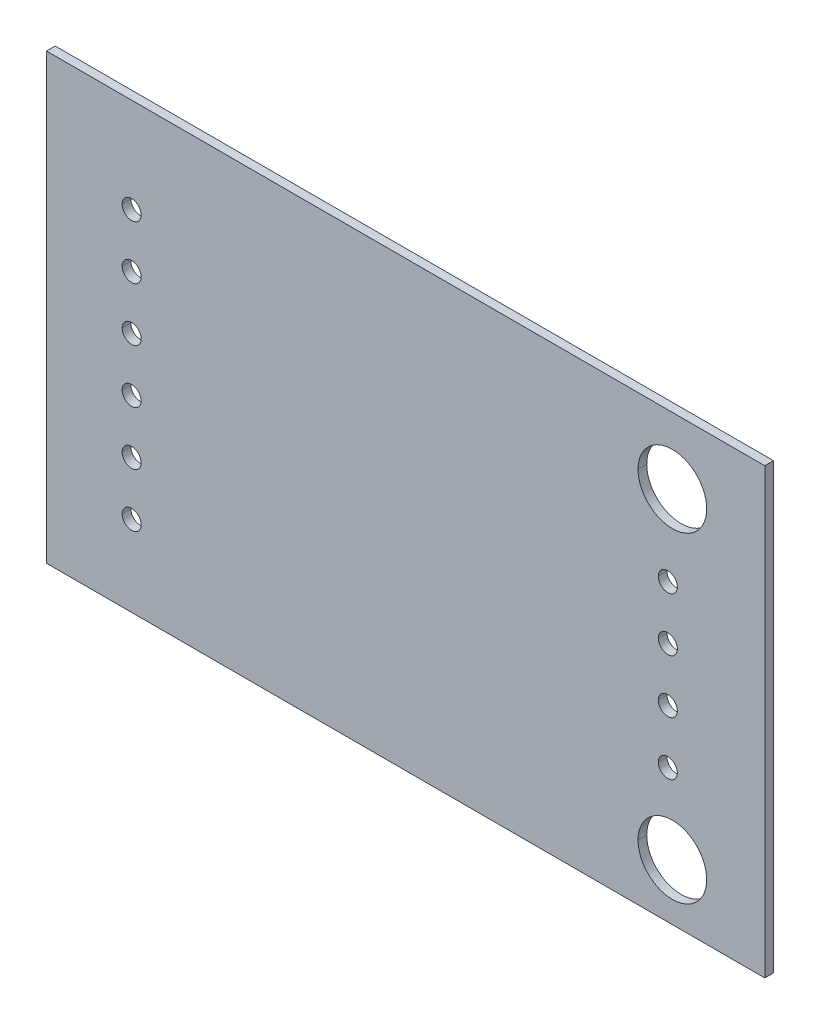
ISO-10303-21;
HEADER;
FILE_DESCRIPTION(('STEP AP214'),'2;1');
FILE_NAME('part.step','',(''),(''),'','','');
FILE_SCHEMA(('AUTOMOTIVE_DESIGN { 1 0 10303 214 1 1 1 1 }'));
ENDSEC;
DATA;
#1=APPLICATION_CONTEXT('core data for automotive mechanical design processes');
#2=APPLICATION_PROTOCOL_DEFINITION('international standard','automotive_design',2000,#1);
#3=PRODUCT_CONTEXT('',#1,'mechanical');
#4=PRODUCT('Part','Part','',(#3));
#5=PRODUCT_RELATED_PRODUCT_CATEGORY('part','',(#4));
#6=PRODUCT_DEFINITION_FORMATION('','',#4);
#7=PRODUCT_DEFINITION_CONTEXT('part definition',#1,'design');
#8=PRODUCT_DEFINITION('design','',#6,#7);
#9=PRODUCT_DEFINITION_SHAPE('','',#8);
#10=(LENGTH_UNIT() NAMED_UNIT(*) SI_UNIT(.MILLI.,.METRE.));
#11=(NAMED_UNIT(*) PLANE_ANGLE_UNIT() SI_UNIT($,.RADIAN.));
#12=(NAMED_UNIT(*) SI_UNIT($,.STERADIAN.) SOLID_ANGLE_UNIT());
#13=UNCERTAINTY_MEASURE_WITH_UNIT(LENGTH_MEASURE(1.E-05),#10,'distance_accuracy_value','');
#14=(GEOMETRIC_REPRESENTATION_CONTEXT(3) GLOBAL_UNCERTAINTY_ASSIGNED_CONTEXT((#13)) GLOBAL_UNIT_ASSIGNED_CONTEXT((#10,
#11,#12)) REPRESENTATION_CONTEXT('',''));
#15=CARTESIAN_POINT('',(0.,0.,0.));
#16=DIRECTION('',(0.,0.,1.));
#17=DIRECTION('',(1.,0.,0.));
#18=AXIS2_PLACEMENT_3D('',#15,#16,#17);
#19=CARTESIAN_POINT('',(29.6250486426,2.658236218721,0.));
#20=DIRECTION('',(0.,0.,1.));
#21=DIRECTION('',(1.,0.,0.));
#22=AXIS2_PLACEMENT_3D('',#19,#20,#21);
#23=CYLINDRICAL_SURFACE('',#22,1.625);
#24=CARTESIAN_POINT('',(29.6250486426,2.658236218721,0.));
#25=DIRECTION('',(0.,0.,1.));
#26=DIRECTION('',(1.,0.,0.));
#27=AXIS2_PLACEMENT_3D('',#24,#25,#26);
#28=CIRCLE('',#27,1.625);
#29=CARTESIAN_POINT('',(28.0000486426,2.658236218721,0.));
#30=VERTEX_POINT('',#29);
#31=CARTESIAN_POINT('',(31.2500486426,2.658236218721,0.));
#32=VERTEX_POINT('',#31);
#33=EDGE_CURVE('E41',#30,#32,#28,.T.);
#34=ORIENTED_EDGE('',*,*,#33,.F.);
#35=DIRECTION('',(0.,0.,1.));
#36=VECTOR('',#35,1.);
#37=CARTESIAN_POINT('',(28.0000486426,2.658236218721,0.));
#38=LINE('',#37,#36);
#39=CARTESIAN_POINT('',(28.0000486426,2.658236218721,0.41148));
#40=VERTEX_POINT('',#39);
#41=EDGE_CURVE('E11',#30,#40,#38,.T.);
#42=ORIENTED_EDGE('',*,*,#41,.T.);
#43=CARTESIAN_POINT('',(29.6250486426,2.658236218721,0.41148));
#44=DIRECTION('',(0.,0.,1.));
#45=DIRECTION('',(1.,0.,0.));
#46=AXIS2_PLACEMENT_3D('',#43,#44,#45);
#47=CIRCLE('',#46,1.625);
#48=CARTESIAN_POINT('',(31.2500486426,2.658236218721,0.41148));
#49=VERTEX_POINT('',#48);
#50=EDGE_CURVE('E28',#40,#49,#47,.T.);
#51=ORIENTED_EDGE('',*,*,#50,.T.);
#52=DIRECTION('',(0.,0.,1.));
#53=VECTOR('',#52,1.);
#54=CARTESIAN_POINT('',(31.2500486426,2.658236218721,0.));
#55=LINE('',#54,#53);
#56=EDGE_CURVE('E479',#32,#49,#55,.T.);
#57=ORIENTED_EDGE('',*,*,#56,.F.);
#58=EDGE_LOOP('',(#34,#42,#51,#57));
#59=FACE_BOUND('',#58,.T.);
#60=ADVANCED_FACE('F17',(#59),#23,.F.);
#61=CARTESIAN_POINT('',(29.6250486426,17.858037309221,0.));
#62=DIRECTION('',(0.,0.,1.));
#63=DIRECTION('',(1.,0.,0.));
#64=AXIS2_PLACEMENT_3D('',#61,#62,#63);
#65=CYLINDRICAL_SURFACE('',#64,1.625);
#66=CARTESIAN_POINT('',(29.6250486426,17.858037309221,0.));
#67=DIRECTION('',(0.,0.,1.));
#68=DIRECTION('',(1.,0.,0.));
#69=AXIS2_PLACEMENT_3D('',#66,#67,#68);
#70=CIRCLE('',#69,1.625);
#71=CARTESIAN_POINT('',(28.0000486426,17.858037309221,0.));
#72=VERTEX_POINT('',#71);
#73=CARTESIAN_POINT('',(31.2500486426,17.858037309221,0.));
#74=VERTEX_POINT('',#73);
#75=EDGE_CURVE('E282',#72,#74,#70,.T.);
#76=ORIENTED_EDGE('',*,*,#75,.F.);
#77=DIRECTION('',(0.,0.,1.));
#78=VECTOR('',#77,1.);
#79=CARTESIAN_POINT('',(28.0000486426,17.858037309221,0.));
#80=LINE('',#79,#78);
#81=CARTESIAN_POINT('',(28.0000486426,17.858037309221,0.41148));
#82=VERTEX_POINT('',#81);
#83=EDGE_CURVE('E408',#72,#82,#80,.T.);
#84=ORIENTED_EDGE('',*,*,#83,.T.);
#85=CARTESIAN_POINT('',(29.6250486426,17.858037309221,0.41148));
#86=DIRECTION('',(0.,0.,1.));
#87=DIRECTION('',(1.,0.,0.));
#88=AXIS2_PLACEMENT_3D('',#85,#86,#87);
#89=CIRCLE('',#88,1.625);
#90=CARTESIAN_POINT('',(31.2500486426,17.858037309221,0.41148));
#91=VERTEX_POINT('',#90);
#92=EDGE_CURVE('E309',#82,#91,#89,.T.);
#93=ORIENTED_EDGE('',*,*,#92,.T.);
#94=DIRECTION('',(0.,0.,1.));
#95=VECTOR('',#94,1.);
#96=CARTESIAN_POINT('',(31.2500486426,17.858037309221,0.));
#97=LINE('',#96,#95);
#98=EDGE_CURVE('E470',#74,#91,#97,.T.);
#99=ORIENTED_EDGE('',*,*,#98,.F.);
#100=EDGE_LOOP('',(#76,#84,#93,#99));
#101=FACE_BOUND('',#100,.T.);
#102=ADVANCED_FACE('F655',(#101),#65,.F.);
#103=CARTESIAN_POINT('',(4.030717621834,8.895479676781,0.));
#104=DIRECTION('',(0.,0.,1.));
#105=DIRECTION('',(1.,0.,0.));
#106=AXIS2_PLACEMENT_3D('',#103,#104,#105);
#107=CYLINDRICAL_SURFACE('',#106,0.4499991);
#108=CARTESIAN_POINT('',(4.030717621834,8.895479676781,0.));
#109=DIRECTION('',(0.,0.,1.));
#110=DIRECTION('',(-1.,0.,0.));
#111=AXIS2_PLACEMENT_3D('',#108,#109,#110);
#112=CIRCLE('',#111,0.4499991);
#113=CARTESIAN_POINT('',(3.580718521834,8.895479676781,0.));
#114=VERTEX_POINT('',#113);
#115=CARTESIAN_POINT('',(4.480716721834,8.895479676781,0.));
#116=VERTEX_POINT('',#115);
#117=EDGE_CURVE('E393',#114,#116,#112,.T.);
#118=ORIENTED_EDGE('',*,*,#117,.F.);
#119=DIRECTION('',(0.,0.,1.));
#120=VECTOR('',#119,1.);
#121=CARTESIAN_POINT('',(3.580718521834,8.895479676781,0.));
#122=LINE('',#121,#120);
#123=CARTESIAN_POINT('',(3.580718521834,8.895479676781,0.41148));
#124=VERTEX_POINT('',#123);
#125=EDGE_CURVE('E305',#114,#124,#122,.T.);
#126=ORIENTED_EDGE('',*,*,#125,.T.);
#127=CARTESIAN_POINT('',(4.030717621834,8.895479676781,0.41148));
#128=DIRECTION('',(0.,0.,1.));
#129=DIRECTION('',(-1.,0.,0.));
#130=AXIS2_PLACEMENT_3D('',#127,#128,#129);
#131=CIRCLE('',#130,0.4499991);
#132=CARTESIAN_POINT('',(4.480716721834,8.895479676781,0.41148));
#133=VERTEX_POINT('',#132);
#134=EDGE_CURVE('E310',#124,#133,#131,.T.);
#135=ORIENTED_EDGE('',*,*,#134,.T.);
#136=DIRECTION('',(0.,0.,1.));
#137=VECTOR('',#136,1.);
#138=CARTESIAN_POINT('',(4.480716721834,8.895479676781,0.));
#139=LINE('',#138,#137);
#140=EDGE_CURVE('E362',#116,#133,#139,.T.);
#141=ORIENTED_EDGE('',*,*,#140,.F.);
#142=EDGE_LOOP('',(#118,#126,#135,#141));
#143=FACE_BOUND('',#142,.T.);
#144=ADVANCED_FACE('F659',(#143),#107,.F.);
#145=CARTESIAN_POINT('',(4.030717621834,6.355479676781,0.));
#146=DIRECTION('',(0.,0.,1.));
#147=DIRECTION('',(1.,0.,0.));
#148=AXIS2_PLACEMENT_3D('',#145,#146,#147);
#149=CYLINDRICAL_SURFACE('',#148,0.4499991);
#150=CARTESIAN_POINT('',(4.030717621834,6.355479676781,0.));
#151=DIRECTION('',(0.,0.,1.));
#152=DIRECTION('',(-1.,0.,0.));
#153=AXIS2_PLACEMENT_3D('',#150,#151,#152);
#154=CIRCLE('',#153,0.4499991);
#155=CARTESIAN_POINT('',(3.580718521834,6.355479676781,0.));
#156=VERTEX_POINT('',#155);
#157=CARTESIAN_POINT('',(4.480716721834,6.355479676781,0.));
#158=VERTEX_POINT('',#157);
#159=EDGE_CURVE('E367',#156,#158,#154,.T.);
#160=ORIENTED_EDGE('',*,*,#159,.F.);
#161=DIRECTION('',(0.,0.,1.));
#162=VECTOR('',#161,1.);
#163=CARTESIAN_POINT('',(3.580718521834,6.355479676781,0.));
#164=LINE('',#163,#162);
#165=CARTESIAN_POINT('',(3.580718521834,6.355479676781,0.41148));
#166=VERTEX_POINT('',#165);
#167=EDGE_CURVE('E342',#156,#166,#164,.T.);
#168=ORIENTED_EDGE('',*,*,#167,.T.);
#169=CARTESIAN_POINT('',(4.030717621834,6.355479676781,0.41148));
#170=DIRECTION('',(0.,0.,1.));
#171=DIRECTION('',(-1.,0.,0.));
#172=AXIS2_PLACEMENT_3D('',#169,#170,#171);
#173=CIRCLE('',#172,0.4499991);
#174=CARTESIAN_POINT('',(4.480716721834,6.355479676781,0.41148));
#175=VERTEX_POINT('',#174);
#176=EDGE_CURVE('E346',#166,#175,#173,.T.);
#177=ORIENTED_EDGE('',*,*,#176,.T.);
#178=DIRECTION('',(0.,0.,1.));
#179=VECTOR('',#178,1.);
#180=CARTESIAN_POINT('',(4.480716721834,6.355479676781,0.));
#181=LINE('',#180,#179);
#182=EDGE_CURVE('E361',#158,#175,#181,.T.);
#183=ORIENTED_EDGE('',*,*,#182,.F.);
#184=EDGE_LOOP('',(#160,#168,#177,#183));
#185=FACE_BOUND('',#184,.T.);
#186=ADVANCED_FACE('F19',(#185),#149,.F.);
#187=CARTESIAN_POINT('',(4.030717621834,16.515479676781,0.));
#188=DIRECTION('',(0.,0.,1.));
#189=DIRECTION('',(1.,0.,0.));
#190=AXIS2_PLACEMENT_3D('',#187,#188,#189);
#191=CYLINDRICAL_SURFACE('',#190,0.4499991);
#192=CARTESIAN_POINT('',(4.030717621834,16.515479676781,0.));
#193=DIRECTION('',(0.,0.,1.));
#194=DIRECTION('',(-1.,0.,0.));
#195=AXIS2_PLACEMENT_3D('',#192,#193,#194);
#196=CIRCLE('',#195,0.4499991);
#197=CARTESIAN_POINT('',(3.580718521834,16.515479676781,0.));
#198=VERTEX_POINT('',#197);
#199=CARTESIAN_POINT('',(4.480716721834,16.515479676781,0.));
#200=VERTEX_POINT('',#199);
#201=EDGE_CURVE('E284',#198,#200,#196,.T.);
#202=ORIENTED_EDGE('',*,*,#201,.F.);
#203=DIRECTION('',(0.,0.,1.));
#204=VECTOR('',#203,1.);
#205=CARTESIAN_POINT('',(3.580718521834,16.515479676781,0.));
#206=LINE('',#205,#204);
#207=CARTESIAN_POINT('',(3.580718521834,16.515479676781,0.41148));
#208=VERTEX_POINT('',#207);
#209=EDGE_CURVE('E392',#198,#208,#206,.T.);
#210=ORIENTED_EDGE('',*,*,#209,.T.);
#211=CARTESIAN_POINT('',(4.030717621834,16.515479676781,0.41148));
#212=DIRECTION('',(0.,0.,1.));
#213=DIRECTION('',(-1.,0.,0.));
#214=AXIS2_PLACEMENT_3D('',#211,#212,#213);
#215=CIRCLE('',#214,0.4499991);
#216=CARTESIAN_POINT('',(4.480716721834,16.515479676781,0.41148));
#217=VERTEX_POINT('',#216);
#218=EDGE_CURVE('E432',#208,#217,#215,.T.);
#219=ORIENTED_EDGE('',*,*,#218,.T.);
#220=DIRECTION('',(0.,0.,1.));
#221=VECTOR('',#220,1.);
#222=CARTESIAN_POINT('',(4.480716721834,16.515479676781,0.));
#223=LINE('',#222,#221);
#224=EDGE_CURVE('E377',#200,#217,#223,.T.);
#225=ORIENTED_EDGE('',*,*,#224,.F.);
#226=EDGE_LOOP('',(#202,#210,#219,#225));
#227=FACE_BOUND('',#226,.T.);
#228=ADVANCED_FACE('F674',(#227),#191,.F.);
#229=CARTESIAN_POINT('',(4.030717621834,11.435479676781,0.));
#230=DIRECTION('',(0.,0.,1.));
#231=DIRECTION('',(1.,0.,0.));
#232=AXIS2_PLACEMENT_3D('',#229,#230,#231);
#233=CYLINDRICAL_SURFACE('',#232,0.4499991);
#234=CARTESIAN_POINT('',(4.030717621834,11.435479676781,0.));
#235=DIRECTION('',(0.,0.,1.));
#236=DIRECTION('',(-1.,0.,0.));
#237=AXIS2_PLACEMENT_3D('',#234,#235,#236);
#238=CIRCLE('',#237,0.4499991);
#239=CARTESIAN_POINT('',(3.580718521834,11.435479676781,0.));
#240=VERTEX_POINT('',#239);
#241=CARTESIAN_POINT('',(4.480716721834,11.435479676781,0.));
#242=VERTEX_POINT('',#241);
#243=EDGE_CURVE('E496',#240,#242,#238,.T.);
#244=ORIENTED_EDGE('',*,*,#243,.F.);
#245=DIRECTION('',(0.,0.,1.));
#246=VECTOR('',#245,1.);
#247=CARTESIAN_POINT('',(3.580718521834,11.435479676781,0.));
#248=LINE('',#247,#246);
#249=CARTESIAN_POINT('',(3.580718521834,11.435479676781,0.41148));
#250=VERTEX_POINT('',#249);
#251=EDGE_CURVE('E366',#240,#250,#248,.T.);
#252=ORIENTED_EDGE('',*,*,#251,.T.);
#253=CARTESIAN_POINT('',(4.030717621834,11.435479676781,0.41148));
#254=DIRECTION('',(0.,0.,1.));
#255=DIRECTION('',(-1.,0.,0.));
#256=AXIS2_PLACEMENT_3D('',#253,#254,#255);
#257=CIRCLE('',#256,0.4499991);
#258=CARTESIAN_POINT('',(4.480716721834,11.435479676781,0.41148));
#259=VERTEX_POINT('',#258);
#260=EDGE_CURVE('E325',#250,#259,#257,.T.);
#261=ORIENTED_EDGE('',*,*,#260,.T.);
#262=DIRECTION('',(0.,0.,1.));
#263=VECTOR('',#262,1.);
#264=CARTESIAN_POINT('',(4.480716721834,11.435479676781,0.));
#265=LINE('',#264,#263);
#266=EDGE_CURVE('E376',#242,#259,#265,.T.);
#267=ORIENTED_EDGE('',*,*,#266,.F.);
#268=EDGE_LOOP('',(#244,#252,#261,#267));
#269=FACE_BOUND('',#268,.T.);
#270=ADVANCED_FACE('F670',(#269),#233,.F.);
#271=CARTESIAN_POINT('',(4.030717621834,13.975479676781,0.));
#272=DIRECTION('',(0.,0.,1.));
#273=DIRECTION('',(1.,0.,0.));
#274=AXIS2_PLACEMENT_3D('',#271,#272,#273);
#275=CYLINDRICAL_SURFACE('',#274,0.4499991);
#276=CARTESIAN_POINT('',(4.030717621834,13.975479676781,0.));
#277=DIRECTION('',(0.,0.,1.));
#278=DIRECTION('',(-1.,0.,0.));
#279=AXIS2_PLACEMENT_3D('',#276,#277,#278);
#280=CIRCLE('',#279,0.4499991);
#281=CARTESIAN_POINT('',(3.580718521834,13.975479676781,0.));
#282=VERTEX_POINT('',#281);
#283=CARTESIAN_POINT('',(4.480716721834,13.975479676781,0.));
#284=VERTEX_POINT('',#283);
#285=EDGE_CURVE('E454',#282,#284,#280,.T.);
#286=ORIENTED_EDGE('',*,*,#285,.F.);
#287=DIRECTION('',(0.,0.,1.));
#288=VECTOR('',#287,1.);
#289=CARTESIAN_POINT('',(3.580718521834,13.975479676781,0.));
#290=LINE('',#289,#288);
#291=CARTESIAN_POINT('',(3.580718521834,13.975479676781,0.41148));
#292=VERTEX_POINT('',#291);
#293=EDGE_CURVE('E321',#282,#292,#290,.T.);
#294=ORIENTED_EDGE('',*,*,#293,.T.);
#295=CARTESIAN_POINT('',(4.030717621834,13.975479676781,0.41148));
#296=DIRECTION('',(0.,0.,1.));
#297=DIRECTION('',(-1.,0.,0.));
#298=AXIS2_PLACEMENT_3D('',#295,#296,#297);
#299=CIRCLE('',#298,0.4499991);
#300=CARTESIAN_POINT('',(4.480716721834,13.975479676781,0.41148));
#301=VERTEX_POINT('',#300);
#302=EDGE_CURVE('E326',#292,#301,#299,.T.);
#303=ORIENTED_EDGE('',*,*,#302,.T.);
#304=DIRECTION('',(0.,0.,1.));
#305=VECTOR('',#304,1.);
#306=CARTESIAN_POINT('',(4.480716721834,13.975479676781,0.));
#307=LINE('',#306,#305);
#308=EDGE_CURVE('E439',#284,#301,#307,.T.);
#309=ORIENTED_EDGE('',*,*,#308,.F.);
#310=EDGE_LOOP('',(#286,#294,#303,#309));
#311=FACE_BOUND('',#310,.T.);
#312=ADVANCED_FACE('F673',(#311),#275,.F.);
#313=CARTESIAN_POINT('',(4.030717621834,3.815479676781,0.));
#314=DIRECTION('',(0.,0.,1.));
#315=DIRECTION('',(1.,0.,0.));
#316=AXIS2_PLACEMENT_3D('',#313,#314,#315);
#317=CYLINDRICAL_SURFACE('',#316,0.4499991);
#318=CARTESIAN_POINT('',(4.030717621834,3.815479676781,0.));
#319=DIRECTION('',(0.,0.,1.));
#320=DIRECTION('',(-1.,0.,0.));
#321=AXIS2_PLACEMENT_3D('',#318,#319,#320);
#322=CIRCLE('',#321,0.4499991);
#323=CARTESIAN_POINT('',(3.580718521834,3.815479676781,0.));
#324=VERTEX_POINT('',#323);
#325=CARTESIAN_POINT('',(4.480716721834,3.815479676781,0.));
#326=VERTEX_POINT('',#325);
#327=EDGE_CURVE('E378',#324,#326,#322,.T.);
#328=ORIENTED_EDGE('',*,*,#327,.F.);
#329=DIRECTION('',(0.,0.,1.));
#330=VECTOR('',#329,1.);
#331=CARTESIAN_POINT('',(3.580718521834,3.815479676781,0.));
#332=LINE('',#331,#330);
#333=CARTESIAN_POINT('',(3.580718521834,3.815479676781,0.41148));
#334=VERTEX_POINT('',#333);
#335=EDGE_CURVE('E331',#324,#334,#332,.T.);
#336=ORIENTED_EDGE('',*,*,#335,.T.);
#337=CARTESIAN_POINT('',(4.030717621834,3.815479676781,0.41148));
#338=DIRECTION('',(0.,0.,1.));
#339=DIRECTION('',(-1.,0.,0.));
#340=AXIS2_PLACEMENT_3D('',#337,#338,#339);
#341=CIRCLE('',#340,0.4499991);
#342=CARTESIAN_POINT('',(4.480716721834,3.815479676781,0.41148));
#343=VERTEX_POINT('',#342);
#344=EDGE_CURVE('E335',#334,#343,#341,.T.);
#345=ORIENTED_EDGE('',*,*,#344,.T.);
#346=DIRECTION('',(0.,0.,1.));
#347=VECTOR('',#346,1.);
#348=CARTESIAN_POINT('',(4.480716721834,3.815479676781,0.));
#349=LINE('',#348,#347);
#350=EDGE_CURVE('E272',#326,#343,#349,.T.);
#351=ORIENTED_EDGE('',*,*,#350,.F.);
#352=EDGE_LOOP('',(#328,#336,#345,#351));
#353=FACE_BOUND('',#352,.T.);
#354=ADVANCED_FACE('F669',(#353),#317,.F.);
#355=CARTESIAN_POINT('',(29.409885994145,6.331813557977,0.));
#356=DIRECTION('',(0.,0.,1.));
#357=DIRECTION('',(1.,0.,0.));
#358=AXIS2_PLACEMENT_3D('',#355,#356,#357);
#359=CYLINDRICAL_SURFACE('',#358,0.4499991);
#360=CARTESIAN_POINT('',(29.409885994145,6.331813557977,0.));
#361=DIRECTION('',(0.,0.,1.));
#362=DIRECTION('',(-1.,0.,0.));
#363=AXIS2_PLACEMENT_3D('',#360,#361,#362);
#364=CIRCLE('',#363,0.4499991);
#365=CARTESIAN_POINT('',(28.959886894145,6.331813557977,0.));
#366=VERTEX_POINT('',#365);
#367=CARTESIAN_POINT('',(29.859885094145,6.331813557977,0.));
#368=VERTEX_POINT('',#367);
#369=EDGE_CURVE('E388',#366,#368,#364,.T.);
#370=ORIENTED_EDGE('',*,*,#369,.F.);
#371=DIRECTION('',(0.,0.,1.));
#372=VECTOR('',#371,1.);
#373=CARTESIAN_POINT('',(28.959886894145,6.331813557977,0.));
#374=LINE('',#373,#372);
#375=CARTESIAN_POINT('',(28.959886894145,6.331813557977,0.41148));
#376=VERTEX_POINT('',#375);
#377=EDGE_CURVE('E264',#366,#376,#374,.T.);
#378=ORIENTED_EDGE('',*,*,#377,.T.);
#379=CARTESIAN_POINT('',(29.409885994145,6.331813557977,0.41148));
#380=DIRECTION('',(0.,0.,1.));
#381=DIRECTION('',(-1.,0.,0.));
#382=AXIS2_PLACEMENT_3D('',#379,#380,#381);
#383=CIRCLE('',#382,0.4499991);
#384=CARTESIAN_POINT('',(29.859885094145,6.331813557977,0.41148));
#385=VERTEX_POINT('',#384);
#386=EDGE_CURVE('E262',#376,#385,#383,.T.);
#387=ORIENTED_EDGE('',*,*,#386,.T.);
#388=DIRECTION('',(0.,0.,1.));
#389=VECTOR('',#388,1.);
#390=CARTESIAN_POINT('',(29.859885094145,6.331813557977,0.));
#391=LINE('',#390,#389);
#392=EDGE_CURVE('E248',#368,#385,#391,.T.);
#393=ORIENTED_EDGE('',*,*,#392,.F.);
#394=EDGE_LOOP('',(#370,#378,#387,#393));
#395=FACE_BOUND('',#394,.T.);
#396=ADVANCED_FACE('F263',(#395),#359,.F.);
#397=CARTESIAN_POINT('',(29.409885994145,13.951813557977,0.));
#398=DIRECTION('',(0.,0.,1.));
#399=DIRECTION('',(1.,0.,0.));
#400=AXIS2_PLACEMENT_3D('',#397,#398,#399);
#401=CYLINDRICAL_SURFACE('',#400,0.4499991);
#402=CARTESIAN_POINT('',(29.409885994145,13.951813557977,0.));
#403=DIRECTION('',(0.,0.,1.));
#404=DIRECTION('',(-1.,0.,0.));
#405=AXIS2_PLACEMENT_3D('',#402,#403,#404);
#406=CIRCLE('',#405,0.4499991);
#407=CARTESIAN_POINT('',(28.959886894145,13.951813557977,0.));
#408=VERTEX_POINT('',#407);
#409=CARTESIAN_POINT('',(29.859885094145,13.951813557977,0.));
#410=VERTEX_POINT('',#409);
#411=EDGE_CURVE('E466',#408,#410,#406,.T.);
#412=ORIENTED_EDGE('',*,*,#411,.F.);
#413=DIRECTION('',(0.,0.,1.));
#414=VECTOR('',#413,1.);
#415=CARTESIAN_POINT('',(28.959886894145,13.951813557977,0.));
#416=LINE('',#415,#414);
#417=CARTESIAN_POINT('',(28.959886894145,13.951813557977,0.41148));
#418=VERTEX_POINT('',#417);
#419=EDGE_CURVE('E267',#408,#418,#416,.T.);
#420=ORIENTED_EDGE('',*,*,#419,.T.);
#421=CARTESIAN_POINT('',(29.409885994145,13.951813557977,0.41148));
#422=DIRECTION('',(0.,0.,1.));
#423=DIRECTION('',(-1.,0.,0.));
#424=AXIS2_PLACEMENT_3D('',#421,#422,#423);
#425=CIRCLE('',#424,0.4499991);
#426=CARTESIAN_POINT('',(29.859885094145,13.951813557977,0.41148));
#427=VERTEX_POINT('',#426);
#428=EDGE_CURVE('E330',#418,#427,#425,.T.);
#429=ORIENTED_EDGE('',*,*,#428,.T.);
#430=DIRECTION('',(0.,0.,1.));
#431=VECTOR('',#430,1.);
#432=CARTESIAN_POINT('',(29.859885094145,13.951813557977,0.));
#433=LINE('',#432,#431);
#434=EDGE_CURVE('E304',#410,#427,#433,.T.);
#435=ORIENTED_EDGE('',*,*,#434,.F.);
#436=EDGE_LOOP('',(#412,#420,#429,#435));
#437=FACE_BOUND('',#436,.T.);
#438=ADVANCED_FACE('F662',(#437),#401,.F.);
#439=CARTESIAN_POINT('',(29.409885994145,8.871813557977,0.));
#440=DIRECTION('',(0.,0.,1.));
#441=DIRECTION('',(1.,0.,0.));
#442=AXIS2_PLACEMENT_3D('',#439,#440,#441);
#443=CYLINDRICAL_SURFACE('',#442,0.4499991);
#444=CARTESIAN_POINT('',(29.409885994145,8.871813557977,0.));
#445=DIRECTION('',(0.,0.,1.));
#446=DIRECTION('',(-1.,0.,0.));
#447=AXIS2_PLACEMENT_3D('',#444,#445,#446);
#448=CIRCLE('',#447,0.4499991);
#449=CARTESIAN_POINT('',(28.959886894145,8.871813557977,0.));
#450=VERTEX_POINT('',#449);
#451=CARTESIAN_POINT('',(29.859885094145,8.871813557977,0.));
#452=VERTEX_POINT('',#451);
#453=EDGE_CURVE('E95',#450,#452,#448,.T.);
#454=ORIENTED_EDGE('',*,*,#453,.F.);
#455=DIRECTION('',(0.,0.,1.));
#456=VECTOR('',#455,1.);
#457=CARTESIAN_POINT('',(28.959886894145,8.871813557977,0.));
#458=LINE('',#457,#456);
#459=CARTESIAN_POINT('',(28.959886894145,8.871813557977,0.41148));
#460=VERTEX_POINT('',#459);
#461=EDGE_CURVE('E415',#450,#460,#458,.T.);
#462=ORIENTED_EDGE('',*,*,#461,.T.);
#463=CARTESIAN_POINT('',(29.409885994145,8.871813557977,0.41148));
#464=DIRECTION('',(0.,0.,1.));
#465=DIRECTION('',(-1.,0.,0.));
#466=AXIS2_PLACEMENT_3D('',#463,#464,#465);
#467=CIRCLE('',#466,0.4499991);
#468=CARTESIAN_POINT('',(29.859885094145,8.871813557977,0.41148));
#469=VERTEX_POINT('',#468);
#470=EDGE_CURVE('E111',#460,#469,#467,.T.);
#471=ORIENTED_EDGE('',*,*,#470,.T.);
#472=DIRECTION('',(0.,0.,1.));
#473=VECTOR('',#472,1.);
#474=CARTESIAN_POINT('',(29.859885094145,8.871813557977,0.));
#475=LINE('',#474,#473);
#476=EDGE_CURVE('E316',#452,#469,#475,.T.);
#477=ORIENTED_EDGE('',*,*,#476,.F.);
#478=EDGE_LOOP('',(#454,#462,#471,#477));
#479=FACE_BOUND('',#478,.T.);
#480=ADVANCED_FACE('F665',(#479),#443,.F.);
#481=CARTESIAN_POINT('',(29.409885994145,11.411813557977,0.));
#482=DIRECTION('',(0.,0.,1.));
#483=DIRECTION('',(1.,0.,0.));
#484=AXIS2_PLACEMENT_3D('',#481,#482,#483);
#485=CYLINDRICAL_SURFACE('',#484,0.4499991);
#486=CARTESIAN_POINT('',(29.409885994145,11.411813557977,0.));
#487=DIRECTION('',(0.,0.,1.));
#488=DIRECTION('',(-1.,0.,0.));
#489=AXIS2_PLACEMENT_3D('',#486,#487,#488);
#490=CIRCLE('',#489,0.4499991);
#491=CARTESIAN_POINT('',(28.959886894145,11.411813557977,0.));
#492=VERTEX_POINT('',#491);
#493=CARTESIAN_POINT('',(29.859885094145,11.411813557977,0.));
#494=VERTEX_POINT('',#493);
#495=EDGE_CURVE('E293',#492,#494,#490,.T.);
#496=ORIENTED_EDGE('',*,*,#495,.F.);
#497=DIRECTION('',(0.,0.,1.));
#498=VECTOR('',#497,1.);
#499=CARTESIAN_POINT('',(28.959886894145,11.411813557977,0.));
#500=LINE('',#499,#498);
#501=CARTESIAN_POINT('',(28.959886894145,11.411813557977,0.41148));
#502=VERTEX_POINT('',#501);
#503=EDGE_CURVE('E340',#492,#502,#500,.T.);
#504=ORIENTED_EDGE('',*,*,#503,.T.);
#505=CARTESIAN_POINT('',(29.409885994145,11.411813557977,0.41148));
#506=DIRECTION('',(0.,0.,1.));
#507=DIRECTION('',(-1.,0.,0.));
#508=AXIS2_PLACEMENT_3D('',#505,#506,#507);
#509=CIRCLE('',#508,0.4499991);
#510=CARTESIAN_POINT('',(29.859885094145,11.411813557977,0.41148));
#511=VERTEX_POINT('',#510);
#512=EDGE_CURVE('E336',#502,#511,#509,.T.);
#513=ORIENTED_EDGE('',*,*,#512,.T.);
#514=DIRECTION('',(0.,0.,1.));
#515=VECTOR('',#514,1.);
#516=CARTESIAN_POINT('',(29.859885094145,11.411813557977,0.));
#517=LINE('',#516,#515);
#518=EDGE_CURVE('E315',#494,#511,#517,.T.);
#519=ORIENTED_EDGE('',*,*,#518,.F.);
#520=EDGE_LOOP('',(#496,#504,#513,#519));
#521=FACE_BOUND('',#520,.T.);
#522=ADVANCED_FACE('F601',(#521),#485,.F.);
#523=CARTESIAN_POINT('',(1.269999999765E-05,21.00001642,0.));
#524=DIRECTION('',(-1.,0.,0.));
#525=DIRECTION('',(0.,1.,0.));
#526=AXIS2_PLACEMENT_3D('',#523,#524,#525);
#527=PLANE('',#526);
#528=DIRECTION('',(0.,-1.,0.));
#529=VECTOR('',#528,1.);
#530=CARTESIAN_POINT('',(1.269999999765E-05,21.00001642,0.41148));
#531=LINE('',#530,#529);
#532=CARTESIAN_POINT('',(1.269999999765E-05,21.00001642,0.41148));
#533=VERTEX_POINT('',#532);
#534=CARTESIAN_POINT('',(1.26999999992E-05,1.269999999947E-05,0.41148));
#535=VERTEX_POINT('',#534);
#536=EDGE_CURVE('E289',#533,#535,#531,.T.);
#537=ORIENTED_EDGE('',*,*,#536,.F.);
#538=DIRECTION('',(0.,0.,1.));
#539=VECTOR('',#538,1.);
#540=CARTESIAN_POINT('',(1.269999999765E-05,21.00001642,0.));
#541=LINE('',#540,#539);
#542=CARTESIAN_POINT('',(1.269999999765E-05,21.00001642,0.));
#543=VERTEX_POINT('',#542);
#544=EDGE_CURVE('E425',#543,#533,#541,.T.);
#545=ORIENTED_EDGE('',*,*,#544,.F.);
#546=DIRECTION('',(0.,-1.,0.));
#547=VECTOR('',#546,1.);
#548=CARTESIAN_POINT('',(1.269999999765E-05,21.00001642,0.));
#549=LINE('',#548,#547);
#550=CARTESIAN_POINT('',(1.26999999992E-05,1.269999999947E-05,0.));
#551=VERTEX_POINT('',#550);
#552=EDGE_CURVE('E341',#543,#551,#549,.T.);
#553=ORIENTED_EDGE('',*,*,#552,.T.);
#554=DIRECTION('',(0.,0.,1.));
#555=VECTOR('',#554,1.);
#556=CARTESIAN_POINT('',(1.26999999992E-05,1.269999999947E-05,0.));
#557=LINE('',#556,#555);
#558=EDGE_CURVE('E420',#551,#535,#557,.T.);
#559=ORIENTED_EDGE('',*,*,#558,.T.);
#560=EDGE_LOOP('',(#537,#545,#553,#559));
#561=FACE_BOUND('',#560,.T.);
#562=ADVANCED_FACE('F621',(#561),#527,.T.);
#563=CARTESIAN_POINT('',(34.00001582,21.00001642,0.));
#564=DIRECTION('',(0.,1.,0.));
#565=DIRECTION('',(1.,0.,0.));
#566=AXIS2_PLACEMENT_3D('',#563,#564,#565);
#567=PLANE('',#566);
#568=DIRECTION('',(-1.,0.,0.));
#569=VECTOR('',#568,1.);
#570=CARTESIAN_POINT('',(34.00001582,21.00001642,0.41148));
#571=LINE('',#570,#569);
#572=CARTESIAN_POINT('',(34.00001582,21.00001642,0.41148));
#573=VERTEX_POINT('',#572);
#574=EDGE_CURVE('E353',#573,#533,#571,.T.);
#575=ORIENTED_EDGE('',*,*,#574,.F.);
#576=DIRECTION('',(0.,0.,1.));
#577=VECTOR('',#576,1.);
#578=CARTESIAN_POINT('',(34.00001582,21.00001642,0.));
#579=LINE('',#578,#577);
#580=CARTESIAN_POINT('',(34.00001582,21.00001642,0.));
#581=VERTEX_POINT('',#580);
#582=EDGE_CURVE('E295',#581,#573,#579,.T.);
#583=ORIENTED_EDGE('',*,*,#582,.F.);
#584=DIRECTION('',(-1.,0.,0.));
#585=VECTOR('',#584,1.);
#586=CARTESIAN_POINT('',(34.00001582,21.00001642,0.));
#587=LINE('',#586,#585);
#588=EDGE_CURVE('E424',#581,#543,#587,.T.);
#589=ORIENTED_EDGE('',*,*,#588,.T.);
#590=ORIENTED_EDGE('',*,*,#544,.T.);
#591=EDGE_LOOP('',(#575,#583,#589,#590));
#592=FACE_BOUND('',#591,.T.);
#593=ADVANCED_FACE('F641',(#592),#567,.T.);
#594=CARTESIAN_POINT('',(34.00001582,1.269999999938E-05,0.));
#595=DIRECTION('',(1.,0.,0.));
#596=DIRECTION('',(0.,1.,0.));
#597=AXIS2_PLACEMENT_3D('',#594,#595,#596);
#598=PLANE('',#597);
#599=DIRECTION('',(0.,1.,0.));
#600=VECTOR('',#599,1.);
#601=CARTESIAN_POINT('',(34.00001582,1.269999999938E-05,0.41148));
#602=LINE('',#601,#600);
#603=CARTESIAN_POINT('',(34.00001582,1.269999999938E-05,0.41148));
#604=VERTEX_POINT('',#603);
#605=EDGE_CURVE('E320',#604,#573,#602,.T.);
#606=ORIENTED_EDGE('',*,*,#605,.F.);
#607=DIRECTION('',(0.,0.,1.));
#608=VECTOR('',#607,1.);
#609=CARTESIAN_POINT('',(34.00001582,1.269999999938E-05,0.));
#610=LINE('',#609,#608);
#611=CARTESIAN_POINT('',(34.00001582,1.269999999938E-05,0.));
#612=VERTEX_POINT('',#611);
#613=EDGE_CURVE('E21',#612,#604,#610,.T.);
#614=ORIENTED_EDGE('',*,*,#613,.F.);
#615=DIRECTION('',(0.,1.,0.));
#616=VECTOR('',#615,1.);
#617=CARTESIAN_POINT('',(34.00001582,1.269999999938E-05,0.));
#618=LINE('',#617,#616);
#619=EDGE_CURVE('E299',#612,#581,#618,.T.);
#620=ORIENTED_EDGE('',*,*,#619,.T.);
#621=ORIENTED_EDGE('',*,*,#582,.T.);
#622=EDGE_LOOP('',(#606,#614,#620,#621));
#623=FACE_BOUND('',#622,.T.);
#624=ADVANCED_FACE('F636',(#623),#598,.T.);
#625=CARTESIAN_POINT('',(1.26999999992E-05,1.269999999947E-05,0.));
#626=DIRECTION('',(0.,-1.,0.));
#627=DIRECTION('',(-1.,0.,0.));
#628=AXIS2_PLACEMENT_3D('',#625,#626,#627);
#629=PLANE('',#628);
#630=DIRECTION('',(1.,0.,0.));
#631=VECTOR('',#630,1.);
#632=CARTESIAN_POINT('',(1.26999999992E-05,1.269999999947E-05,0.41148));
#633=LINE('',#632,#631);
#634=EDGE_CURVE('E294',#535,#604,#633,.T.);
#635=ORIENTED_EDGE('',*,*,#634,.F.);
#636=ORIENTED_EDGE('',*,*,#558,.F.);
#637=DIRECTION('',(1.,0.,0.));
#638=VECTOR('',#637,1.);
#639=CARTESIAN_POINT('',(1.26999999992E-05,1.269999999947E-05,0.));
#640=LINE('',#639,#638);
#641=EDGE_CURVE('E300',#551,#612,#640,.T.);
#642=ORIENTED_EDGE('',*,*,#641,.T.);
#643=ORIENTED_EDGE('',*,*,#613,.T.);
#644=EDGE_LOOP('',(#635,#636,#642,#643));
#645=FACE_BOUND('',#644,.T.);
#646=ADVANCED_FACE('F629',(#645),#629,.T.);
#647=CARTESIAN_POINT('',(0.,0.,0.));
#648=DIRECTION('',(0.,0.,1.));
#649=DIRECTION('',(1.,0.,0.));
#650=AXIS2_PLACEMENT_3D('',#647,#648,#649);
#651=PLANE('',#650);
#652=ORIENTED_EDGE('',*,*,#552,.F.);
#653=ORIENTED_EDGE('',*,*,#588,.F.);
#654=ORIENTED_EDGE('',*,*,#619,.F.);
#655=ORIENTED_EDGE('',*,*,#641,.F.);
#656=EDGE_LOOP('',(#652,#653,#654,#655));
#657=FACE_BOUND('',#656,.T.);
#658=CARTESIAN_POINT('',(29.6250486426,2.658236218721,0.));
#659=DIRECTION('',(0.,0.,1.));
#660=DIRECTION('',(1.,0.,0.));
#661=AXIS2_PLACEMENT_3D('',#658,#659,#660);
#662=CIRCLE('',#661,1.625);
#663=EDGE_CURVE('E482',#32,#30,#662,.T.);
#664=ORIENTED_EDGE('',*,*,#663,.T.);
#665=ORIENTED_EDGE('',*,*,#33,.T.);
#666=EDGE_LOOP('',(#664,#665));
#667=FACE_BOUND('',#666,.T.);
#668=CARTESIAN_POINT('',(29.6250486426,17.858037309221,0.));
#669=DIRECTION('',(0.,0.,1.));
#670=DIRECTION('',(1.,0.,0.));
#671=AXIS2_PLACEMENT_3D('',#668,#669,#670);
#672=CIRCLE('',#671,1.625);
#673=EDGE_CURVE('E459',#74,#72,#672,.T.);
#674=ORIENTED_EDGE('',*,*,#673,.T.);
#675=ORIENTED_EDGE('',*,*,#75,.T.);
#676=EDGE_LOOP('',(#674,#675));
#677=FACE_BOUND('',#676,.T.);
#678=CARTESIAN_POINT('',(4.030717621834,8.895479676781,0.));
#679=DIRECTION('',(0.,0.,1.));
#680=DIRECTION('',(-1.,0.,0.));
#681=AXIS2_PLACEMENT_3D('',#678,#679,#680);
#682=CIRCLE('',#681,0.4499991);
#683=EDGE_CURVE('E397',#116,#114,#682,.T.);
#684=ORIENTED_EDGE('',*,*,#683,.T.);
#685=ORIENTED_EDGE('',*,*,#117,.T.);
#686=EDGE_LOOP('',(#684,#685));
#687=FACE_BOUND('',#686,.T.);
#688=CARTESIAN_POINT('',(4.030717621834,6.355479676781,0.));
#689=DIRECTION('',(0.,0.,1.));
#690=DIRECTION('',(-1.,0.,0.));
#691=AXIS2_PLACEMENT_3D('',#688,#689,#690);
#692=CIRCLE('',#691,0.4499991);
#693=EDGE_CURVE('E371',#158,#156,#692,.T.);
#694=ORIENTED_EDGE('',*,*,#693,.T.);
#695=ORIENTED_EDGE('',*,*,#159,.T.);
#696=EDGE_LOOP('',(#694,#695));
#697=FACE_BOUND('',#696,.T.);
#698=CARTESIAN_POINT('',(4.030717621834,16.515479676781,0.));
#699=DIRECTION('',(0.,0.,1.));
#700=DIRECTION('',(-1.,0.,0.));
#701=AXIS2_PLACEMENT_3D('',#698,#699,#700);
#702=CIRCLE('',#701,0.4499991);
#703=EDGE_CURVE('E287',#200,#198,#702,.T.);
#704=ORIENTED_EDGE('',*,*,#703,.T.);
#705=ORIENTED_EDGE('',*,*,#201,.T.);
#706=EDGE_LOOP('',(#704,#705));
#707=FACE_BOUND('',#706,.T.);
#708=CARTESIAN_POINT('',(4.030717621834,11.435479676781,0.));
#709=DIRECTION('',(0.,0.,1.));
#710=DIRECTION('',(-1.,0.,0.));
#711=AXIS2_PLACEMENT_3D('',#708,#709,#710);
#712=CIRCLE('',#711,0.4499991);
#713=EDGE_CURVE('E288',#242,#240,#712,.T.);
#714=ORIENTED_EDGE('',*,*,#713,.T.);
#715=ORIENTED_EDGE('',*,*,#243,.T.);
#716=EDGE_LOOP('',(#714,#715));
#717=FACE_BOUND('',#716,.T.);
#718=CARTESIAN_POINT('',(4.030717621834,13.975479676781,0.));
#719=DIRECTION('',(0.,0.,1.));
#720=DIRECTION('',(-1.,0.,0.));
#721=AXIS2_PLACEMENT_3D('',#718,#719,#720);
#722=CIRCLE('',#721,0.4499991);
#723=EDGE_CURVE('E492',#284,#282,#722,.T.);
#724=ORIENTED_EDGE('',*,*,#723,.T.);
#725=ORIENTED_EDGE('',*,*,#285,.T.);
#726=EDGE_LOOP('',(#724,#725));
#727=FACE_BOUND('',#726,.T.);
#728=CARTESIAN_POINT('',(4.030717621834,3.815479676781,0.));
#729=DIRECTION('',(0.,0.,1.));
#730=DIRECTION('',(-1.,0.,0.));
#731=AXIS2_PLACEMENT_3D('',#728,#729,#730);
#732=CIRCLE('',#731,0.4499991);
#733=EDGE_CURVE('E382',#326,#324,#732,.T.);
#734=ORIENTED_EDGE('',*,*,#733,.T.);
#735=ORIENTED_EDGE('',*,*,#327,.T.);
#736=EDGE_LOOP('',(#734,#735));
#737=FACE_BOUND('',#736,.T.);
#738=CARTESIAN_POINT('',(29.409885994145,6.331813557977,0.));
#739=DIRECTION('',(0.,0.,1.));
#740=DIRECTION('',(-1.,0.,0.));
#741=AXIS2_PLACEMENT_3D('',#738,#739,#740);
#742=CIRCLE('',#741,0.4499991);
#743=EDGE_CURVE('E255',#368,#366,#742,.T.);
#744=ORIENTED_EDGE('',*,*,#743,.T.);
#745=ORIENTED_EDGE('',*,*,#369,.T.);
#746=EDGE_LOOP('',(#744,#745));
#747=FACE_BOUND('',#746,.T.);
#748=CARTESIAN_POINT('',(29.409885994145,13.951813557977,0.));
#749=DIRECTION('',(0.,0.,1.));
#750=DIRECTION('',(-1.,0.,0.));
#751=AXIS2_PLACEMENT_3D('',#748,#749,#750);
#752=CIRCLE('',#751,0.4499991);
#753=EDGE_CURVE('E435',#410,#408,#752,.T.);
#754=ORIENTED_EDGE('',*,*,#753,.T.);
#755=ORIENTED_EDGE('',*,*,#411,.T.);
#756=EDGE_LOOP('',(#754,#755));
#757=FACE_BOUND('',#756,.T.);
#758=CARTESIAN_POINT('',(29.409885994145,8.871813557977,0.));
#759=DIRECTION('',(0.,0.,1.));
#760=DIRECTION('',(-1.,0.,0.));
#761=AXIS2_PLACEMENT_3D('',#758,#759,#760);
#762=CIRCLE('',#761,0.4499991);
#763=EDGE_CURVE('E418',#452,#450,#762,.T.);
#764=ORIENTED_EDGE('',*,*,#763,.T.);
#765=ORIENTED_EDGE('',*,*,#453,.T.);
#766=EDGE_LOOP('',(#764,#765));
#767=FACE_BOUND('',#766,.T.);
#768=CARTESIAN_POINT('',(29.409885994145,11.411813557977,0.));
#769=DIRECTION('',(0.,0.,1.));
#770=DIRECTION('',(-1.,0.,0.));
#771=AXIS2_PLACEMENT_3D('',#768,#769,#770);
#772=CIRCLE('',#771,0.4499991);
#773=EDGE_CURVE('E419',#494,#492,#772,.T.);
#774=ORIENTED_EDGE('',*,*,#773,.T.);
#775=ORIENTED_EDGE('',*,*,#495,.T.);
#776=EDGE_LOOP('',(#774,#775));
#777=FACE_BOUND('',#776,.T.);
#778=ADVANCED_FACE('F532',(#657,#667,#677,#687,#697,#707,#717,#727,#737,#747,#757,#767,#777),
#651,.F.);
#779=CARTESIAN_POINT('',(0.,0.,0.41148));
#780=DIRECTION('',(0.,0.,1.));
#781=DIRECTION('',(1.,0.,0.));
#782=AXIS2_PLACEMENT_3D('',#779,#780,#781);
#783=PLANE('',#782);
#784=ORIENTED_EDGE('',*,*,#536,.T.);
#785=ORIENTED_EDGE('',*,*,#634,.T.);
#786=ORIENTED_EDGE('',*,*,#605,.T.);
#787=ORIENTED_EDGE('',*,*,#574,.T.);
#788=EDGE_LOOP('',(#784,#785,#786,#787));
#789=FACE_BOUND('',#788,.T.);
#790=CARTESIAN_POINT('',(29.6250486426,2.658236218721,0.41148));
#791=DIRECTION('',(0.,0.,1.));
#792=DIRECTION('',(1.,0.,0.));
#793=AXIS2_PLACEMENT_3D('',#790,#791,#792);
#794=CIRCLE('',#793,1.625);
#795=EDGE_CURVE('E475',#49,#40,#794,.T.);
#796=ORIENTED_EDGE('',*,*,#795,.F.);
#797=ORIENTED_EDGE('',*,*,#50,.F.);
#798=EDGE_LOOP('',(#796,#797));
#799=FACE_BOUND('',#798,.T.);
#800=CARTESIAN_POINT('',(29.6250486426,17.858037309221,0.41148));
#801=DIRECTION('',(0.,0.,1.));
#802=DIRECTION('',(1.,0.,0.));
#803=AXIS2_PLACEMENT_3D('',#800,#801,#802);
#804=CIRCLE('',#803,1.625);
#805=EDGE_CURVE('E514',#91,#82,#804,.T.);
#806=ORIENTED_EDGE('',*,*,#805,.F.);
#807=ORIENTED_EDGE('',*,*,#92,.F.);
#808=EDGE_LOOP('',(#806,#807));
#809=FACE_BOUND('',#808,.T.);
#810=CARTESIAN_POINT('',(4.030717621834,8.895479676781,0.41148));
#811=DIRECTION('',(0.,0.,1.));
#812=DIRECTION('',(-1.,0.,0.));
#813=AXIS2_PLACEMENT_3D('',#810,#811,#812);
#814=CIRCLE('',#813,0.4499991);
#815=EDGE_CURVE('E467',#133,#124,#814,.T.);
#816=ORIENTED_EDGE('',*,*,#815,.F.);
#817=ORIENTED_EDGE('',*,*,#134,.F.);
#818=EDGE_LOOP('',(#816,#817));
#819=FACE_BOUND('',#818,.T.);
#820=CARTESIAN_POINT('',(4.030717621834,6.355479676781,0.41148));
#821=DIRECTION('',(0.,0.,1.));
#822=DIRECTION('',(-1.,0.,0.));
#823=AXIS2_PLACEMENT_3D('',#820,#821,#822);
#824=CIRCLE('',#823,0.4499991);
#825=EDGE_CURVE('E357',#175,#166,#824,.T.);
#826=ORIENTED_EDGE('',*,*,#825,.F.);
#827=ORIENTED_EDGE('',*,*,#176,.F.);
#828=EDGE_LOOP('',(#826,#827));
#829=FACE_BOUND('',#828,.T.);
#830=CARTESIAN_POINT('',(4.030717621834,16.515479676781,0.41148));
#831=DIRECTION('',(0.,0.,1.));
#832=DIRECTION('',(-1.,0.,0.));
#833=AXIS2_PLACEMENT_3D('',#830,#831,#832);
#834=CIRCLE('',#833,0.4499991);
#835=EDGE_CURVE('E400',#217,#208,#834,.T.);
#836=ORIENTED_EDGE('',*,*,#835,.F.);
#837=ORIENTED_EDGE('',*,*,#218,.F.);
#838=EDGE_LOOP('',(#836,#837));
#839=FACE_BOUND('',#838,.T.);
#840=CARTESIAN_POINT('',(4.030717621834,11.435479676781,0.41148));
#841=DIRECTION('',(0.,0.,1.));
#842=DIRECTION('',(-1.,0.,0.));
#843=AXIS2_PLACEMENT_3D('',#840,#841,#842);
#844=CIRCLE('',#843,0.4499991);
#845=EDGE_CURVE('E372',#259,#250,#844,.T.);
#846=ORIENTED_EDGE('',*,*,#845,.F.);
#847=ORIENTED_EDGE('',*,*,#260,.F.);
#848=EDGE_LOOP('',(#846,#847));
#849=FACE_BOUND('',#848,.T.);
#850=CARTESIAN_POINT('',(4.030717621834,13.975479676781,0.41148));
#851=DIRECTION('',(0.,0.,1.));
#852=DIRECTION('',(-1.,0.,0.));
#853=AXIS2_PLACEMENT_3D('',#850,#851,#852);
#854=CIRCLE('',#853,0.4499991);
#855=EDGE_CURVE('E442',#301,#292,#854,.T.);
#856=ORIENTED_EDGE('',*,*,#855,.F.);
#857=ORIENTED_EDGE('',*,*,#302,.F.);
#858=EDGE_LOOP('',(#856,#857));
#859=FACE_BOUND('',#858,.T.);
#860=CARTESIAN_POINT('',(4.030717621834,3.815479676781,0.41148));
#861=DIRECTION('',(0.,0.,1.));
#862=DIRECTION('',(-1.,0.,0.));
#863=AXIS2_PLACEMENT_3D('',#860,#861,#862);
#864=CIRCLE('',#863,0.4499991);
#865=EDGE_CURVE('E278',#343,#334,#864,.T.);
#866=ORIENTED_EDGE('',*,*,#865,.F.);
#867=ORIENTED_EDGE('',*,*,#344,.F.);
#868=EDGE_LOOP('',(#866,#867));
#869=FACE_BOUND('',#868,.T.);
#870=CARTESIAN_POINT('',(29.409885994145,6.331813557977,0.41148));
#871=DIRECTION('',(0.,0.,1.));
#872=DIRECTION('',(-1.,0.,0.));
#873=AXIS2_PLACEMENT_3D('',#870,#871,#872);
#874=CIRCLE('',#873,0.4499991);
#875=EDGE_CURVE('E253',#385,#376,#874,.T.);
#876=ORIENTED_EDGE('',*,*,#875,.F.);
#877=ORIENTED_EDGE('',*,*,#386,.F.);
#878=EDGE_LOOP('',(#876,#877));
#879=FACE_BOUND('',#878,.T.);
#880=CARTESIAN_POINT('',(29.409885994145,13.951813557977,0.41148));
#881=DIRECTION('',(0.,0.,1.));
#882=DIRECTION('',(-1.,0.,0.));
#883=AXIS2_PLACEMENT_3D('',#880,#881,#882);
#884=CIRCLE('',#883,0.4499991);
#885=EDGE_CURVE('E259',#427,#418,#884,.T.);
#886=ORIENTED_EDGE('',*,*,#885,.F.);
#887=ORIENTED_EDGE('',*,*,#428,.F.);
#888=EDGE_LOOP('',(#886,#887));
#889=FACE_BOUND('',#888,.T.);
#890=CARTESIAN_POINT('',(29.409885994145,8.871813557977,0.41148));
#891=DIRECTION('',(0.,0.,1.));
#892=DIRECTION('',(-1.,0.,0.));
#893=AXIS2_PLACEMENT_3D('',#890,#891,#892);
#894=CIRCLE('',#893,0.4499991);
#895=EDGE_CURVE('E352',#469,#460,#894,.T.);
#896=ORIENTED_EDGE('',*,*,#895,.F.);
#897=ORIENTED_EDGE('',*,*,#470,.F.);
#898=EDGE_LOOP('',(#896,#897));
#899=FACE_BOUND('',#898,.T.);
#900=CARTESIAN_POINT('',(29.409885994145,11.411813557977,0.41148));
#901=DIRECTION('',(0.,0.,1.));
#902=DIRECTION('',(-1.,0.,0.));
#903=AXIS2_PLACEMENT_3D('',#900,#901,#902);
#904=CIRCLE('',#903,0.4499991);
#905=EDGE_CURVE('E311',#511,#502,#904,.T.);
#906=ORIENTED_EDGE('',*,*,#905,.F.);
#907=ORIENTED_EDGE('',*,*,#512,.F.);
#908=EDGE_LOOP('',(#906,#907));
#909=FACE_BOUND('',#908,.T.);
#910=ADVANCED_FACE('F269',(#789,#799,#809,#819,#829,#839,#849,#859,#869,#879,#889,#899,#909),
#783,.T.);
#911=CARTESIAN_POINT('',(29.409885994145,11.411813557977,0.));
#912=DIRECTION('',(0.,0.,1.));
#913=DIRECTION('',(1.,0.,0.));
#914=AXIS2_PLACEMENT_3D('',#911,#912,#913);
#915=CYLINDRICAL_SURFACE('',#914,0.4499991);
#916=ORIENTED_EDGE('',*,*,#503,.F.);
#917=ORIENTED_EDGE('',*,*,#773,.F.);
#918=ORIENTED_EDGE('',*,*,#518,.T.);
#919=ORIENTED_EDGE('',*,*,#905,.T.);
#920=EDGE_LOOP('',(#916,#917,#918,#919));
#921=FACE_BOUND('',#920,.T.);
#922=ADVANCED_FACE('F606',(#921),#915,.F.);
#923=CARTESIAN_POINT('',(29.409885994145,8.871813557977,0.));
#924=DIRECTION('',(0.,0.,1.));
#925=DIRECTION('',(1.,0.,0.));
#926=AXIS2_PLACEMENT_3D('',#923,#924,#925);
#927=CYLINDRICAL_SURFACE('',#926,0.4499991);
#928=ORIENTED_EDGE('',*,*,#461,.F.);
#929=ORIENTED_EDGE('',*,*,#763,.F.);
#930=ORIENTED_EDGE('',*,*,#476,.T.);
#931=ORIENTED_EDGE('',*,*,#895,.T.);
#932=EDGE_LOOP('',(#928,#929,#930,#931));
#933=FACE_BOUND('',#932,.T.);
#934=ADVANCED_FACE('F714',(#933),#927,.F.);
#935=CARTESIAN_POINT('',(29.409885994145,13.951813557977,0.));
#936=DIRECTION('',(0.,0.,1.));
#937=DIRECTION('',(1.,0.,0.));
#938=AXIS2_PLACEMENT_3D('',#935,#936,#937);
#939=CYLINDRICAL_SURFACE('',#938,0.4499991);
#940=ORIENTED_EDGE('',*,*,#419,.F.);
#941=ORIENTED_EDGE('',*,*,#753,.F.);
#942=ORIENTED_EDGE('',*,*,#434,.T.);
#943=ORIENTED_EDGE('',*,*,#885,.T.);
#944=EDGE_LOOP('',(#940,#941,#942,#943));
#945=FACE_BOUND('',#944,.T.);
#946=ADVANCED_FACE('F700',(#945),#939,.F.);
#947=CARTESIAN_POINT('',(29.409885994145,6.331813557977,0.));
#948=DIRECTION('',(0.,0.,1.));
#949=DIRECTION('',(1.,0.,0.));
#950=AXIS2_PLACEMENT_3D('',#947,#948,#949);
#951=CYLINDRICAL_SURFACE('',#950,0.4499991);
#952=ORIENTED_EDGE('',*,*,#377,.F.);
#953=ORIENTED_EDGE('',*,*,#743,.F.);
#954=ORIENTED_EDGE('',*,*,#392,.T.);
#955=ORIENTED_EDGE('',*,*,#875,.T.);
#956=EDGE_LOOP('',(#952,#953,#954,#955));
#957=FACE_BOUND('',#956,.T.);
#958=ADVANCED_FACE('F251',(#957),#951,.F.);
#959=CARTESIAN_POINT('',(4.030717621834,3.815479676781,0.));
#960=DIRECTION('',(0.,0.,1.));
#961=DIRECTION('',(1.,0.,0.));
#962=AXIS2_PLACEMENT_3D('',#959,#960,#961);
#963=CYLINDRICAL_SURFACE('',#962,0.4499991);
#964=ORIENTED_EDGE('',*,*,#335,.F.);
#965=ORIENTED_EDGE('',*,*,#733,.F.);
#966=ORIENTED_EDGE('',*,*,#350,.T.);
#967=ORIENTED_EDGE('',*,*,#865,.T.);
#968=EDGE_LOOP('',(#964,#965,#966,#967));
#969=FACE_BOUND('',#968,.T.);
#970=ADVANCED_FACE('F697',(#969),#963,.F.);
#971=CARTESIAN_POINT('',(4.030717621834,13.975479676781,0.));
#972=DIRECTION('',(0.,0.,1.));
#973=DIRECTION('',(1.,0.,0.));
#974=AXIS2_PLACEMENT_3D('',#971,#972,#973);
#975=CYLINDRICAL_SURFACE('',#974,0.4499991);
#976=ORIENTED_EDGE('',*,*,#293,.F.);
#977=ORIENTED_EDGE('',*,*,#723,.F.);
#978=ORIENTED_EDGE('',*,*,#308,.T.);
#979=ORIENTED_EDGE('',*,*,#855,.T.);
#980=EDGE_LOOP('',(#976,#977,#978,#979));
#981=FACE_BOUND('',#980,.T.);
#982=ADVANCED_FACE('F694',(#981),#975,.F.);
#983=CARTESIAN_POINT('',(4.030717621834,11.435479676781,0.));
#984=DIRECTION('',(0.,0.,1.));
#985=DIRECTION('',(1.,0.,0.));
#986=AXIS2_PLACEMENT_3D('',#983,#984,#985);
#987=CYLINDRICAL_SURFACE('',#986,0.4499991);
#988=ORIENTED_EDGE('',*,*,#251,.F.);
#989=ORIENTED_EDGE('',*,*,#713,.F.);
#990=ORIENTED_EDGE('',*,*,#266,.T.);
#991=ORIENTED_EDGE('',*,*,#845,.T.);
#992=EDGE_LOOP('',(#988,#989,#990,#991));
#993=FACE_BOUND('',#992,.T.);
#994=ADVANCED_FACE('F536',(#993),#987,.F.);
#995=CARTESIAN_POINT('',(4.030717621834,16.515479676781,0.));
#996=DIRECTION('',(0.,0.,1.));
#997=DIRECTION('',(1.,0.,0.));
#998=AXIS2_PLACEMENT_3D('',#995,#996,#997);
#999=CYLINDRICAL_SURFACE('',#998,0.4499991);
#1000=ORIENTED_EDGE('',*,*,#209,.F.);
#1001=ORIENTED_EDGE('',*,*,#703,.F.);
#1002=ORIENTED_EDGE('',*,*,#224,.T.);
#1003=ORIENTED_EDGE('',*,*,#835,.T.);
#1004=EDGE_LOOP('',(#1000,#1001,#1002,#1003));
#1005=FACE_BOUND('',#1004,.T.);
#1006=ADVANCED_FACE('F675',(#1005),#999,.F.);
#1007=CARTESIAN_POINT('',(4.030717621834,6.355479676781,0.));
#1008=DIRECTION('',(0.,0.,1.));
#1009=DIRECTION('',(1.,0.,0.));
#1010=AXIS2_PLACEMENT_3D('',#1007,#1008,#1009);
#1011=CYLINDRICAL_SURFACE('',#1010,0.4499991);
#1012=ORIENTED_EDGE('',*,*,#167,.F.);
#1013=ORIENTED_EDGE('',*,*,#693,.F.);
#1014=ORIENTED_EDGE('',*,*,#182,.T.);
#1015=ORIENTED_EDGE('',*,*,#825,.T.);
#1016=EDGE_LOOP('',(#1012,#1013,#1014,#1015));
#1017=FACE_BOUND('',#1016,.T.);
#1018=ADVANCED_FACE('F678',(#1017),#1011,.F.);
#1019=CARTESIAN_POINT('',(4.030717621834,8.895479676781,0.));
#1020=DIRECTION('',(0.,0.,1.));
#1021=DIRECTION('',(1.,0.,0.));
#1022=AXIS2_PLACEMENT_3D('',#1019,#1020,#1021);
#1023=CYLINDRICAL_SURFACE('',#1022,0.4499991);
#1024=ORIENTED_EDGE('',*,*,#125,.F.);
#1025=ORIENTED_EDGE('',*,*,#683,.F.);
#1026=ORIENTED_EDGE('',*,*,#140,.T.);
#1027=ORIENTED_EDGE('',*,*,#815,.T.);
#1028=EDGE_LOOP('',(#1024,#1025,#1026,#1027));
#1029=FACE_BOUND('',#1028,.T.);
#1030=ADVANCED_FACE('F680',(#1029),#1023,.F.);
#1031=CARTESIAN_POINT('',(29.6250486426,17.858037309221,0.));
#1032=DIRECTION('',(0.,0.,1.));
#1033=DIRECTION('',(1.,0.,0.));
#1034=AXIS2_PLACEMENT_3D('',#1031,#1032,#1033);
#1035=CYLINDRICAL_SURFACE('',#1034,1.625);
#1036=ORIENTED_EDGE('',*,*,#83,.F.);
#1037=ORIENTED_EDGE('',*,*,#673,.F.);
#1038=ORIENTED_EDGE('',*,*,#98,.T.);
#1039=ORIENTED_EDGE('',*,*,#805,.T.);
#1040=EDGE_LOOP('',(#1036,#1037,#1038,#1039));
#1041=FACE_BOUND('',#1040,.T.);
#1042=ADVANCED_FACE('F573',(#1041),#1035,.F.);
#1043=CARTESIAN_POINT('',(29.6250486426,2.658236218721,0.));
#1044=DIRECTION('',(0.,0.,1.));
#1045=DIRECTION('',(1.,0.,0.));
#1046=AXIS2_PLACEMENT_3D('',#1043,#1044,#1045);
#1047=CYLINDRICAL_SURFACE('',#1046,1.625);
#1048=ORIENTED_EDGE('',*,*,#41,.F.);
#1049=ORIENTED_EDGE('',*,*,#663,.F.);
#1050=ORIENTED_EDGE('',*,*,#56,.T.);
#1051=ORIENTED_EDGE('',*,*,#795,.T.);
#1052=EDGE_LOOP('',(#1048,#1049,#1050,#1051));
#1053=FACE_BOUND('',#1052,.T.);
#1054=ADVANCED_FACE('F690',(#1053),#1047,.F.);
#1055=CLOSED_SHELL('',(#60,#102,#144,#186,#228,#270,#312,#354,#396,#438,#480,#522,#562,#593,
#624,#646,#778,#910,#922,#934,#946,#958,#970,#982,#994,#1006,#1018,#1030,#1042,#1054));
#1056=MANIFOLD_SOLID_BREP('B1',#1055);
#1057=ADVANCED_BREP_SHAPE_REPRESENTATION('',(#18,#1056),#14);
#1058=SHAPE_DEFINITION_REPRESENTATION(#9,#1057);
ENDSEC;
END-ISO-10303-21;
